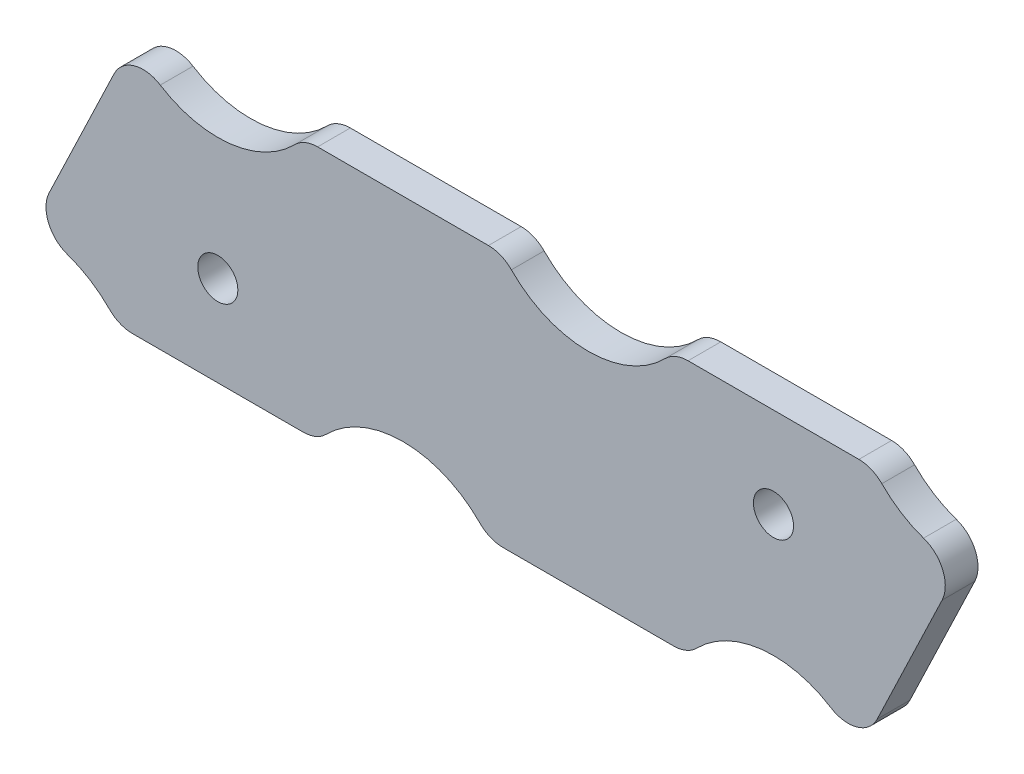
ISO-10303-21;
HEADER;
FILE_DESCRIPTION(('STEP AP214'),'2;1');
FILE_NAME('part.step','',(''),(''),'','','');
FILE_SCHEMA(('AUTOMOTIVE_DESIGN { 1 0 10303 214 1 1 1 1 }'));
ENDSEC;
DATA;
#1=APPLICATION_CONTEXT('core data for automotive mechanical design processes');
#2=APPLICATION_PROTOCOL_DEFINITION('international standard','automotive_design',2000,#1);
#3=PRODUCT_CONTEXT('',#1,'mechanical');
#4=PRODUCT('Part','Part','',(#3));
#5=PRODUCT_RELATED_PRODUCT_CATEGORY('part','',(#4));
#6=PRODUCT_DEFINITION_FORMATION('','',#4);
#7=PRODUCT_DEFINITION_CONTEXT('part definition',#1,'design');
#8=PRODUCT_DEFINITION('design','',#6,#7);
#9=PRODUCT_DEFINITION_SHAPE('','',#8);
#10=(LENGTH_UNIT() NAMED_UNIT(*) SI_UNIT(.MILLI.,.METRE.));
#11=(NAMED_UNIT(*) PLANE_ANGLE_UNIT() SI_UNIT($,.RADIAN.));
#12=(NAMED_UNIT(*) SI_UNIT($,.STERADIAN.) SOLID_ANGLE_UNIT());
#13=UNCERTAINTY_MEASURE_WITH_UNIT(LENGTH_MEASURE(1.E-05),#10,'distance_accuracy_value','');
#14=(GEOMETRIC_REPRESENTATION_CONTEXT(3) GLOBAL_UNCERTAINTY_ASSIGNED_CONTEXT((#13)) GLOBAL_UNIT_ASSIGNED_CONTEXT((#10,
#11,#12)) REPRESENTATION_CONTEXT('',''));
#15=CARTESIAN_POINT('',(0.,0.,0.));
#16=DIRECTION('',(0.,0.,1.));
#17=DIRECTION('',(1.,0.,0.));
#18=AXIS2_PLACEMENT_3D('',#15,#16,#17);
#19=CARTESIAN_POINT('',(68.275,34.775,2.032));
#20=DIRECTION('',(0.,0.,-1.));
#21=DIRECTION('',(-1.,0.,0.));
#22=AXIS2_PLACEMENT_3D('',#19,#20,#21);
#23=CYLINDRICAL_SURFACE('',#22,6.7);
#24=CARTESIAN_POINT('',(68.275,34.775,0.));
#25=DIRECTION('',(0.,0.,1.));
#26=DIRECTION('',(1.,0.,0.));
#27=AXIS2_PLACEMENT_3D('',#24,#25,#26);
#28=CIRCLE('',#27,6.7);
#29=CARTESIAN_POINT('',(63.5025512651196,30.0724758827903,0.));
#30=VERTEX_POINT('',#29);
#31=CARTESIAN_POINT('',(66.0934857954846,28.4400970192514,0.));
#32=VERTEX_POINT('',#31);
#33=EDGE_CURVE('E232',#30,#32,#28,.T.);
#34=ORIENTED_EDGE('',*,*,#33,.F.);
#35=DIRECTION('',(0.,0.,-1.));
#36=VECTOR('',#35,1.);
#37=CARTESIAN_POINT('',(63.5025512651196,30.0724758827903,2.032));
#38=LINE('',#37,#36);
#39=CARTESIAN_POINT('',(63.5025512651196,30.0724758827903,2.032));
#40=VERTEX_POINT('',#39);
#41=EDGE_CURVE('E210',#30,#40,#38,.F.);
#42=ORIENTED_EDGE('',*,*,#41,.T.);
#43=CARTESIAN_POINT('',(68.275,34.775,2.032));
#44=DIRECTION('',(0.,0.,1.));
#45=DIRECTION('',(1.,0.,0.));
#46=AXIS2_PLACEMENT_3D('',#43,#44,#45);
#47=CIRCLE('',#46,6.7);
#48=CARTESIAN_POINT('',(66.0934857954846,28.4400970192514,2.032));
#49=VERTEX_POINT('',#48);
#50=EDGE_CURVE('E265',#40,#49,#47,.T.);
#51=ORIENTED_EDGE('',*,*,#50,.T.);
#52=DIRECTION('',(0.,0.,-1.));
#53=VECTOR('',#52,1.);
#54=CARTESIAN_POINT('',(66.0934857954846,28.4400970192514,2.032));
#55=LINE('',#54,#53);
#56=EDGE_CURVE('E215',#49,#32,#55,.T.);
#57=ORIENTED_EDGE('',*,*,#56,.T.);
#58=EDGE_LOOP('',(#34,#42,#51,#57));
#59=FACE_BOUND('',#58,.T.);
#60=ADVANCED_FACE('F43',(#59),#23,.F.);
#61=CARTESIAN_POINT('',(0.,30.6687373403397,2.032));
#62=DIRECTION('',(0.,-1.,0.));
#63=DIRECTION('',(1.,0.,0.));
#64=AXIS2_PLACEMENT_3D('',#61,#62,#63);
#65=PLANE('',#64);
#66=DIRECTION('',(-1.,0.,0.));
#67=VECTOR('',#66,1.);
#68=CARTESIAN_POINT('',(0.,30.6687373403397,2.032));
#69=LINE('',#68,#67);
#70=CARTESIAN_POINT('',(62.0779397024688,30.6687373403397,2.032));
#71=VERTEX_POINT('',#70);
#72=CARTESIAN_POINT('',(51.4720602975312,30.6687373403397,2.032));
#73=VERTEX_POINT('',#72);
#74=EDGE_CURVE('E225',#71,#73,#69,.T.);
#75=ORIENTED_EDGE('',*,*,#74,.F.);
#76=DIRECTION('',(0.,0.,1.));
#77=VECTOR('',#76,1.);
#78=CARTESIAN_POINT('',(62.0779397024688,30.6687373403397,0.));
#79=LINE('',#78,#77);
#80=CARTESIAN_POINT('',(62.0779397024688,30.6687373403397,0.));
#81=VERTEX_POINT('',#80);
#82=EDGE_CURVE('E209',#71,#81,#79,.F.);
#83=ORIENTED_EDGE('',*,*,#82,.T.);
#84=DIRECTION('',(-1.,0.,0.));
#85=VECTOR('',#84,1.);
#86=CARTESIAN_POINT('',(0.,30.6687373403397,0.));
#87=LINE('',#86,#85);
#88=CARTESIAN_POINT('',(51.4720602975312,30.6687373403397,0.));
#89=VERTEX_POINT('',#88);
#90=EDGE_CURVE('E222',#81,#89,#87,.T.);
#91=ORIENTED_EDGE('',*,*,#90,.T.);
#92=DIRECTION('',(0.,0.,1.));
#93=VECTOR('',#92,1.);
#94=CARTESIAN_POINT('',(51.4720602975312,30.6687373403397,2.032));
#95=LINE('',#94,#93);
#96=EDGE_CURVE('E227',#89,#73,#95,.T.);
#97=ORIENTED_EDGE('',*,*,#96,.T.);
#98=EDGE_LOOP('',(#75,#83,#91,#97));
#99=FACE_BOUND('',#98,.T.);
#100=ADVANCED_FACE('F221',(#99),#65,.F.);
#101=CARTESIAN_POINT('',(45.275,34.775,2.032));
#102=DIRECTION('',(0.,0.,-1.));
#103=DIRECTION('',(-1.,0.,0.));
#104=AXIS2_PLACEMENT_3D('',#101,#102,#103);
#105=CYLINDRICAL_SURFACE('',#104,6.7);
#106=CARTESIAN_POINT('',(45.275,34.775,2.032));
#107=DIRECTION('',(0.,0.,1.));
#108=DIRECTION('',(1.,0.,0.));
#109=AXIS2_PLACEMENT_3D('',#106,#107,#108);
#110=CIRCLE('',#109,6.7);
#111=CARTESIAN_POINT('',(40.5025512651196,30.0724758827903,2.032));
#112=VERTEX_POINT('',#111);
#113=CARTESIAN_POINT('',(50.0474487348804,30.0724758827903,2.032));
#114=VERTEX_POINT('',#113);
#115=EDGE_CURVE('E483',#112,#114,#110,.T.);
#116=ORIENTED_EDGE('',*,*,#115,.T.);
#117=DIRECTION('',(0.,0.,-1.));
#118=VECTOR('',#117,1.);
#119=CARTESIAN_POINT('',(50.0474487348804,30.0724758827903,2.032));
#120=LINE('',#119,#118);
#121=CARTESIAN_POINT('',(50.0474487348804,30.0724758827903,0.));
#122=VERTEX_POINT('',#121);
#123=EDGE_CURVE('E316',#114,#122,#120,.T.);
#124=ORIENTED_EDGE('',*,*,#123,.T.);
#125=CARTESIAN_POINT('',(45.275,34.775,0.));
#126=DIRECTION('',(0.,0.,1.));
#127=DIRECTION('',(1.,0.,0.));
#128=AXIS2_PLACEMENT_3D('',#125,#126,#127);
#129=CIRCLE('',#128,6.7);
#130=CARTESIAN_POINT('',(40.5025512651196,30.0724758827903,0.));
#131=VERTEX_POINT('',#130);
#132=EDGE_CURVE('E231',#131,#122,#129,.T.);
#133=ORIENTED_EDGE('',*,*,#132,.F.);
#134=DIRECTION('',(0.,0.,-1.));
#135=VECTOR('',#134,1.);
#136=CARTESIAN_POINT('',(40.5025512651196,30.0724758827903,2.032));
#137=LINE('',#136,#135);
#138=EDGE_CURVE('E314',#131,#112,#137,.F.);
#139=ORIENTED_EDGE('',*,*,#138,.T.);
#140=EDGE_LOOP('',(#116,#124,#133,#139));
#141=FACE_BOUND('',#140,.T.);
#142=ADVANCED_FACE('F460',(#141),#105,.F.);
#143=CARTESIAN_POINT('',(0.,30.6687373403397,2.032));
#144=DIRECTION('',(0.,-1.,0.));
#145=DIRECTION('',(0.,0.,-1.));
#146=AXIS2_PLACEMENT_3D('',#143,#144,#145);
#147=PLANE('',#146);
#148=DIRECTION('',(-1.,0.,0.));
#149=VECTOR('',#148,1.);
#150=CARTESIAN_POINT('',(0.,30.6687373403397,2.032));
#151=LINE('',#150,#149);
#152=CARTESIAN_POINT('',(39.0779397024688,30.6687373403397,2.032));
#153=VERTEX_POINT('',#152);
#154=CARTESIAN_POINT('',(28.4720602975312,30.6687373403397,2.032));
#155=VERTEX_POINT('',#154);
#156=EDGE_CURVE('E480',#153,#155,#151,.T.);
#157=ORIENTED_EDGE('',*,*,#156,.F.);
#158=DIRECTION('',(0.,0.,1.));
#159=VECTOR('',#158,1.);
#160=CARTESIAN_POINT('',(39.0779397024688,30.6687373403397,0.));
#161=LINE('',#160,#159);
#162=CARTESIAN_POINT('',(39.0779397024688,30.6687373403397,0.));
#163=VERTEX_POINT('',#162);
#164=EDGE_CURVE('E321',#153,#163,#161,.F.);
#165=ORIENTED_EDGE('',*,*,#164,.T.);
#166=DIRECTION('',(-1.,0.,0.));
#167=VECTOR('',#166,1.);
#168=CARTESIAN_POINT('',(0.,30.6687373403397,0.));
#169=LINE('',#168,#167);
#170=CARTESIAN_POINT('',(28.4720602975312,30.6687373403397,0.));
#171=VERTEX_POINT('',#170);
#172=EDGE_CURVE('E234',#163,#171,#169,.T.);
#173=ORIENTED_EDGE('',*,*,#172,.T.);
#174=DIRECTION('',(0.,0.,1.));
#175=VECTOR('',#174,1.);
#176=CARTESIAN_POINT('',(28.4720602975312,30.6687373403397,2.032));
#177=LINE('',#176,#175);
#178=EDGE_CURVE('E319',#171,#155,#177,.T.);
#179=ORIENTED_EDGE('',*,*,#178,.T.);
#180=EDGE_LOOP('',(#157,#165,#173,#179));
#181=FACE_BOUND('',#180,.T.);
#182=ADVANCED_FACE('F485',(#181),#147,.F.);
#183=CARTESIAN_POINT('',(22.275,34.775,2.032));
#184=DIRECTION('',(0.,0.,-1.));
#185=DIRECTION('',(-1.,0.,0.));
#186=AXIS2_PLACEMENT_3D('',#183,#184,#185);
#187=CYLINDRICAL_SURFACE('',#186,6.7);
#188=CARTESIAN_POINT('',(22.275,34.775,2.032));
#189=DIRECTION('',(0.,0.,1.));
#190=DIRECTION('',(1.,0.,0.));
#191=AXIS2_PLACEMENT_3D('',#188,#189,#190);
#192=CIRCLE('',#191,6.7);
#193=CARTESIAN_POINT('',(18.7044817972191,29.1056614350869,2.032));
#194=VERTEX_POINT('',#193);
#195=CARTESIAN_POINT('',(27.0474487348804,30.0724758827903,2.032));
#196=VERTEX_POINT('',#195);
#197=EDGE_CURVE('E386',#194,#196,#192,.T.);
#198=ORIENTED_EDGE('',*,*,#197,.T.);
#199=DIRECTION('',(0.,0.,-1.));
#200=VECTOR('',#199,1.);
#201=CARTESIAN_POINT('',(27.0474487348804,30.0724758827903,2.032));
#202=LINE('',#201,#200);
#203=CARTESIAN_POINT('',(27.0474487348804,30.0724758827903,0.));
#204=VERTEX_POINT('',#203);
#205=EDGE_CURVE('E326',#196,#204,#202,.T.);
#206=ORIENTED_EDGE('',*,*,#205,.T.);
#207=CARTESIAN_POINT('',(22.275,34.775,0.));
#208=DIRECTION('',(0.,0.,1.));
#209=DIRECTION('',(1.,0.,0.));
#210=AXIS2_PLACEMENT_3D('',#207,#208,#209);
#211=CIRCLE('',#210,6.7);
#212=CARTESIAN_POINT('',(18.7044817972191,29.1056614350869,0.));
#213=VERTEX_POINT('',#212);
#214=EDGE_CURVE('E242',#213,#204,#211,.T.);
#215=ORIENTED_EDGE('',*,*,#214,.F.);
#216=DIRECTION('',(0.,0.,-1.));
#217=VECTOR('',#216,1.);
#218=CARTESIAN_POINT('',(18.7044817972191,29.1056614350869,2.032));
#219=LINE('',#218,#217);
#220=EDGE_CURVE('E324',#213,#194,#219,.F.);
#221=ORIENTED_EDGE('',*,*,#220,.T.);
#222=EDGE_LOOP('',(#198,#206,#215,#221));
#223=FACE_BOUND('',#222,.T.);
#224=ADVANCED_FACE('F544',(#223),#187,.F.);
#225=CARTESIAN_POINT('',(1.85861827457443,-0.890587923233582,2.032));
#226=DIRECTION('',(-0.901816028724632,0.432120180430553,0.));
#227=DIRECTION('',(-0.432120180430553,-0.901816028724632,0.));
#228=AXIS2_PLACEMENT_3D('',#225,#226,#227);
#229=PLANE('',#228);
#230=DIRECTION('',(0.432120180430553,0.901816028724632,0.));
#231=VECTOR('',#230,1.);
#232=CARTESIAN_POINT('',(1.85861827457443,-0.890587923233582,0.));
#233=LINE('',#232,#231);
#234=CARTESIAN_POINT('',(11.8040804170707,19.8651591567586,0.));
#235=VERTEX_POINT('',#234);
#236=CARTESIAN_POINT('',(15.8350234105815,28.2775619258248,0.));
#237=VERTEX_POINT('',#236);
#238=EDGE_CURVE('E245',#235,#237,#233,.T.);
#239=ORIENTED_EDGE('',*,*,#238,.F.);
#240=DIRECTION('',(0.,0.,-1.));
#241=VECTOR('',#240,1.);
#242=CARTESIAN_POINT('',(11.8040804170707,19.8651591567586,2.032));
#243=LINE('',#242,#241);
#244=CARTESIAN_POINT('',(11.8040804170707,19.8651591567586,2.032));
#245=VERTEX_POINT('',#244);
#246=EDGE_CURVE('E11',#235,#245,#243,.F.);
#247=ORIENTED_EDGE('',*,*,#246,.T.);
#248=DIRECTION('',(0.432120180430553,0.901816028724632,0.));
#249=VECTOR('',#248,1.);
#250=CARTESIAN_POINT('',(1.85861827457443,-0.890587923233582,2.032));
#251=LINE('',#250,#249);
#252=CARTESIAN_POINT('',(15.8350234105815,28.2775619258248,2.032));
#253=VERTEX_POINT('',#252);
#254=EDGE_CURVE('E365',#245,#253,#251,.T.);
#255=ORIENTED_EDGE('',*,*,#254,.T.);
#256=DIRECTION('',(0.,0.,-1.));
#257=VECTOR('',#256,1.);
#258=CARTESIAN_POINT('',(15.8350234105815,28.2775619258248,2.032));
#259=LINE('',#258,#257);
#260=EDGE_CURVE('E51',#253,#237,#259,.T.);
#261=ORIENTED_EDGE('',*,*,#260,.T.);
#262=EDGE_LOOP('',(#239,#247,#255,#261));
#263=FACE_BOUND('',#262,.T.);
#264=ADVANCED_FACE('F362',(#263),#229,.T.);
#265=CARTESIAN_POINT('',(10.775,10.775,2.032));
#266=DIRECTION('',(0.,0.,-1.));
#267=DIRECTION('',(-1.,0.,0.));
#268=AXIS2_PLACEMENT_3D('',#265,#266,#267);
#269=CYLINDRICAL_SURFACE('',#268,6.7);
#270=CARTESIAN_POINT('',(10.775,10.775,0.));
#271=DIRECTION('',(0.,0.,1.));
#272=DIRECTION('',(1.,0.,0.));
#273=AXIS2_PLACEMENT_3D('',#270,#271,#272);
#274=CIRCLE('',#273,6.7);
#275=CARTESIAN_POINT('',(15.5474487348804,15.4775241172097,0.));
#276=VERTEX_POINT('',#275);
#277=CARTESIAN_POINT('',(12.9565142045153,17.1099029807486,0.));
#278=VERTEX_POINT('',#277);
#279=EDGE_CURVE('E248',#276,#278,#274,.T.);
#280=ORIENTED_EDGE('',*,*,#279,.F.);
#281=DIRECTION('',(0.,0.,-1.));
#282=VECTOR('',#281,1.);
#283=CARTESIAN_POINT('',(15.5474487348804,15.4775241172097,2.032));
#284=LINE('',#283,#282);
#285=CARTESIAN_POINT('',(15.5474487348804,15.4775241172097,2.032));
#286=VERTEX_POINT('',#285);
#287=EDGE_CURVE('E337',#276,#286,#284,.F.);
#288=ORIENTED_EDGE('',*,*,#287,.T.);
#289=CARTESIAN_POINT('',(10.775,10.775,2.032));
#290=DIRECTION('',(0.,0.,1.));
#291=DIRECTION('',(1.,0.,0.));
#292=AXIS2_PLACEMENT_3D('',#289,#290,#291);
#293=CIRCLE('',#292,6.7);
#294=CARTESIAN_POINT('',(12.9565142045153,17.1099029807486,2.032));
#295=VERTEX_POINT('',#294);
#296=EDGE_CURVE('E379',#286,#295,#293,.T.);
#297=ORIENTED_EDGE('',*,*,#296,.T.);
#298=DIRECTION('',(0.,0.,-1.));
#299=VECTOR('',#298,1.);
#300=CARTESIAN_POINT('',(12.9565142045153,17.1099029807486,2.032));
#301=LINE('',#300,#299);
#302=EDGE_CURVE('E334',#295,#278,#301,.T.);
#303=ORIENTED_EDGE('',*,*,#302,.T.);
#304=EDGE_LOOP('',(#280,#288,#297,#303));
#305=FACE_BOUND('',#304,.T.);
#306=ADVANCED_FACE('F376',(#305),#269,.F.);
#307=CARTESIAN_POINT('',(0.,14.8812626596603,2.032));
#308=DIRECTION('',(0.,1.,0.));
#309=DIRECTION('',(-1.,0.,0.));
#310=AXIS2_PLACEMENT_3D('',#307,#308,#309);
#311=PLANE('',#310);
#312=DIRECTION('',(1.,0.,0.));
#313=VECTOR('',#312,1.);
#314=CARTESIAN_POINT('',(0.,14.8812626596603,2.032));
#315=LINE('',#314,#313);
#316=CARTESIAN_POINT('',(16.9720602975312,14.8812626596603,2.032));
#317=VERTEX_POINT('',#316);
#318=CARTESIAN_POINT('',(27.5779397024688,14.8812626596603,2.032));
#319=VERTEX_POINT('',#318);
#320=EDGE_CURVE('E381',#317,#319,#315,.T.);
#321=ORIENTED_EDGE('',*,*,#320,.F.);
#322=DIRECTION('',(0.,0.,1.));
#323=VECTOR('',#322,1.);
#324=CARTESIAN_POINT('',(16.9720602975312,14.8812626596603,0.));
#325=LINE('',#324,#323);
#326=CARTESIAN_POINT('',(16.9720602975312,14.8812626596603,0.));
#327=VERTEX_POINT('',#326);
#328=EDGE_CURVE('E331',#317,#327,#325,.F.);
#329=ORIENTED_EDGE('',*,*,#328,.T.);
#330=DIRECTION('',(1.,0.,0.));
#331=VECTOR('',#330,1.);
#332=CARTESIAN_POINT('',(0.,14.8812626596603,0.));
#333=LINE('',#332,#331);
#334=CARTESIAN_POINT('',(27.5779397024688,14.8812626596603,0.));
#335=VERTEX_POINT('',#334);
#336=EDGE_CURVE('E251',#327,#335,#333,.T.);
#337=ORIENTED_EDGE('',*,*,#336,.T.);
#338=DIRECTION('',(0.,0.,1.));
#339=VECTOR('',#338,1.);
#340=CARTESIAN_POINT('',(27.5779397024688,14.8812626596603,2.032));
#341=LINE('',#340,#339);
#342=EDGE_CURVE('E329',#335,#319,#341,.T.);
#343=ORIENTED_EDGE('',*,*,#342,.T.);
#344=EDGE_LOOP('',(#321,#329,#337,#343));
#345=FACE_BOUND('',#344,.T.);
#346=ADVANCED_FACE('F440',(#345),#311,.F.);
#347=CARTESIAN_POINT('',(33.775,10.775,2.032));
#348=DIRECTION('',(0.,0.,-1.));
#349=DIRECTION('',(-1.,0.,0.));
#350=AXIS2_PLACEMENT_3D('',#347,#348,#349);
#351=CYLINDRICAL_SURFACE('',#350,6.7);
#352=CARTESIAN_POINT('',(33.775,10.775,2.032));
#353=DIRECTION('',(0.,0.,1.));
#354=DIRECTION('',(1.,0.,0.));
#355=AXIS2_PLACEMENT_3D('',#352,#353,#354);
#356=CIRCLE('',#355,6.7);
#357=CARTESIAN_POINT('',(38.5474487348804,15.4775241172097,2.032));
#358=VERTEX_POINT('',#357);
#359=CARTESIAN_POINT('',(29.0025512651196,15.4775241172097,2.032));
#360=VERTEX_POINT('',#359);
#361=EDGE_CURVE('E384',#358,#360,#356,.T.);
#362=ORIENTED_EDGE('',*,*,#361,.T.);
#363=DIRECTION('',(0.,0.,-1.));
#364=VECTOR('',#363,1.);
#365=CARTESIAN_POINT('',(29.0025512651196,15.4775241172097,2.032));
#366=LINE('',#365,#364);
#367=CARTESIAN_POINT('',(29.0025512651196,15.4775241172097,0.));
#368=VERTEX_POINT('',#367);
#369=EDGE_CURVE('E341',#360,#368,#366,.T.);
#370=ORIENTED_EDGE('',*,*,#369,.T.);
#371=CARTESIAN_POINT('',(33.775,10.775,0.));
#372=DIRECTION('',(0.,0.,1.));
#373=DIRECTION('',(1.,0.,0.));
#374=AXIS2_PLACEMENT_3D('',#371,#372,#373);
#375=CIRCLE('',#374,6.7);
#376=CARTESIAN_POINT('',(38.5474487348804,15.4775241172097,0.));
#377=VERTEX_POINT('',#376);
#378=EDGE_CURVE('E254',#377,#368,#375,.T.);
#379=ORIENTED_EDGE('',*,*,#378,.F.);
#380=DIRECTION('',(0.,0.,-1.));
#381=VECTOR('',#380,1.);
#382=CARTESIAN_POINT('',(38.5474487348804,15.4775241172097,2.032));
#383=LINE('',#382,#381);
#384=EDGE_CURVE('E339',#377,#358,#383,.F.);
#385=ORIENTED_EDGE('',*,*,#384,.T.);
#386=EDGE_LOOP('',(#362,#370,#379,#385));
#387=FACE_BOUND('',#386,.T.);
#388=ADVANCED_FACE('F430',(#387),#351,.F.);
#389=CARTESIAN_POINT('',(0.,14.8812626596604,2.032));
#390=DIRECTION('',(0.,1.,0.));
#391=DIRECTION('',(0.,0.,1.));
#392=AXIS2_PLACEMENT_3D('',#389,#390,#391);
#393=PLANE('',#392);
#394=DIRECTION('',(1.,0.,0.));
#395=VECTOR('',#394,1.);
#396=CARTESIAN_POINT('',(0.,14.8812626596604,2.032));
#397=LINE('',#396,#395);
#398=CARTESIAN_POINT('',(39.9720602975312,14.8812626596604,2.032));
#399=VERTEX_POINT('',#398);
#400=CARTESIAN_POINT('',(50.5779397024688,14.8812626596604,2.032));
#401=VERTEX_POINT('',#400);
#402=EDGE_CURVE('E392',#399,#401,#397,.T.);
#403=ORIENTED_EDGE('',*,*,#402,.F.);
#404=DIRECTION('',(0.,0.,1.));
#405=VECTOR('',#404,1.);
#406=CARTESIAN_POINT('',(39.9720602975312,14.8812626596604,0.));
#407=LINE('',#406,#405);
#408=CARTESIAN_POINT('',(39.9720602975312,14.8812626596604,0.));
#409=VERTEX_POINT('',#408);
#410=EDGE_CURVE('E346',#399,#409,#407,.F.);
#411=ORIENTED_EDGE('',*,*,#410,.T.);
#412=DIRECTION('',(1.,0.,0.));
#413=VECTOR('',#412,1.);
#414=CARTESIAN_POINT('',(0.,14.8812626596604,0.));
#415=LINE('',#414,#413);
#416=CARTESIAN_POINT('',(50.5779397024688,14.8812626596604,0.));
#417=VERTEX_POINT('',#416);
#418=EDGE_CURVE('E257',#409,#417,#415,.T.);
#419=ORIENTED_EDGE('',*,*,#418,.T.);
#420=DIRECTION('',(0.,0.,1.));
#421=VECTOR('',#420,1.);
#422=CARTESIAN_POINT('',(50.5779397024688,14.8812626596604,2.032));
#423=LINE('',#422,#421);
#424=EDGE_CURVE('E344',#417,#401,#423,.T.);
#425=ORIENTED_EDGE('',*,*,#424,.T.);
#426=EDGE_LOOP('',(#403,#411,#419,#425));
#427=FACE_BOUND('',#426,.T.);
#428=ADVANCED_FACE('F422',(#427),#393,.F.);
#429=CARTESIAN_POINT('',(56.775,10.775,2.032));
#430=DIRECTION('',(0.,0.,-1.));
#431=DIRECTION('',(-1.,0.,0.));
#432=AXIS2_PLACEMENT_3D('',#429,#430,#431);
#433=CYLINDRICAL_SURFACE('',#432,6.70000000000001);
#434=CARTESIAN_POINT('',(56.775,10.775,2.032));
#435=DIRECTION('',(0.,0.,1.));
#436=DIRECTION('',(1.,0.,0.));
#437=AXIS2_PLACEMENT_3D('',#434,#435,#436);
#438=CIRCLE('',#437,6.70000000000001);
#439=CARTESIAN_POINT('',(60.3455182027809,16.4443385649131,2.032));
#440=VERTEX_POINT('',#439);
#441=CARTESIAN_POINT('',(52.0025512651196,15.4775241172097,2.032));
#442=VERTEX_POINT('',#441);
#443=EDGE_CURVE('E395',#440,#442,#438,.T.);
#444=ORIENTED_EDGE('',*,*,#443,.T.);
#445=DIRECTION('',(0.,0.,-1.));
#446=VECTOR('',#445,1.);
#447=CARTESIAN_POINT('',(52.0025512651196,15.4775241172097,2.032));
#448=LINE('',#447,#446);
#449=CARTESIAN_POINT('',(52.0025512651196,15.4775241172097,0.));
#450=VERTEX_POINT('',#449);
#451=EDGE_CURVE('E351',#442,#450,#448,.T.);
#452=ORIENTED_EDGE('',*,*,#451,.T.);
#453=CARTESIAN_POINT('',(56.775,10.775,0.));
#454=DIRECTION('',(0.,0.,1.));
#455=DIRECTION('',(1.,0.,0.));
#456=AXIS2_PLACEMENT_3D('',#453,#454,#455);
#457=CIRCLE('',#456,6.70000000000001);
#458=CARTESIAN_POINT('',(60.3455182027809,16.4443385649131,0.));
#459=VERTEX_POINT('',#458);
#460=EDGE_CURVE('E260',#459,#450,#457,.T.);
#461=ORIENTED_EDGE('',*,*,#460,.F.);
#462=DIRECTION('',(0.,0.,-1.));
#463=VECTOR('',#462,1.);
#464=CARTESIAN_POINT('',(60.3455182027809,16.4443385649131,2.032));
#465=LINE('',#464,#463);
#466=EDGE_CURVE('E349',#459,#440,#465,.F.);
#467=ORIENTED_EDGE('',*,*,#466,.T.);
#468=EDGE_LOOP('',(#444,#452,#461,#467));
#469=FACE_BOUND('',#468,.T.);
#470=ADVANCED_FACE('F413',(#469),#433,.F.);
#471=CARTESIAN_POINT('',(44.6800333314969,-21.4091826380089,2.032));
#472=DIRECTION('',(-0.901816028724632,0.432120180430553,0.));
#473=DIRECTION('',(-0.432120180430553,-0.901816028724632,0.));
#474=AXIS2_PLACEMENT_3D('',#471,#472,#473);
#475=PLANE('',#474);
#476=DIRECTION('',(0.432120180430553,0.901816028724632,0.));
#477=VECTOR('',#476,1.);
#478=CARTESIAN_POINT('',(44.6800333314969,-21.4091826380089,0.));
#479=LINE('',#478,#477);
#480=CARTESIAN_POINT('',(63.2149765894185,17.2724380741753,0.));
#481=VERTEX_POINT('',#480);
#482=CARTESIAN_POINT('',(67.2459195829293,25.6848408432414,0.));
#483=VERTEX_POINT('',#482);
#484=EDGE_CURVE('E263',#481,#483,#479,.T.);
#485=ORIENTED_EDGE('',*,*,#484,.T.);
#486=DIRECTION('',(0.,0.,1.));
#487=VECTOR('',#486,1.);
#488=CARTESIAN_POINT('',(67.2459195829293,25.6848408432414,2.032));
#489=LINE('',#488,#487);
#490=CARTESIAN_POINT('',(67.2459195829293,25.6848408432414,2.032));
#491=VERTEX_POINT('',#490);
#492=EDGE_CURVE('E58',#483,#491,#489,.T.);
#493=ORIENTED_EDGE('',*,*,#492,.T.);
#494=DIRECTION('',(0.432120180430553,0.901816028724632,0.));
#495=VECTOR('',#494,1.);
#496=CARTESIAN_POINT('',(44.6800333314969,-21.4091826380089,2.032));
#497=LINE('',#496,#495);
#498=CARTESIAN_POINT('',(63.2149765894185,17.2724380741753,2.032));
#499=VERTEX_POINT('',#498);
#500=EDGE_CURVE('E266',#499,#491,#497,.T.);
#501=ORIENTED_EDGE('',*,*,#500,.F.);
#502=DIRECTION('',(0.,0.,1.));
#503=VECTOR('',#502,1.);
#504=CARTESIAN_POINT('',(63.2149765894185,17.2724380741753,0.));
#505=LINE('',#504,#503);
#506=EDGE_CURVE('E354',#499,#481,#505,.F.);
#507=ORIENTED_EDGE('',*,*,#506,.T.);
#508=EDGE_LOOP('',(#485,#493,#501,#507));
#509=FACE_BOUND('',#508,.T.);
#510=ADVANCED_FACE('F407',(#509),#475,.F.);
#511=CARTESIAN_POINT('',(0.,0.,2.032));
#512=DIRECTION('',(0.,0.,1.));
#513=DIRECTION('',(1.,0.,0.));
#514=AXIS2_PLACEMENT_3D('',#511,#512,#513);
#515=PLANE('',#514);
#516=CARTESIAN_POINT('',(22.275,20.4920677095079,2.032));
#517=DIRECTION('',(0.,0.,1.));
#518=DIRECTION('',(1.,0.,0.));
#519=AXIS2_PLACEMENT_3D('',#516,#517,#518);
#520=CIRCLE('',#519,1.2446);
#521=CARTESIAN_POINT('',(23.5196,20.4920677095079,2.032));
#522=VERTEX_POINT('',#521);
#523=EDGE_CURVE('E500',#522,#522,#520,.T.);
#524=ORIENTED_EDGE('',*,*,#523,.F.);
#525=EDGE_LOOP('',(#524));
#526=FACE_BOUND('',#525,.T.);
#527=CARTESIAN_POINT('',(56.775,25.0579322904922,2.032));
#528=DIRECTION('',(0.,0.,1.));
#529=DIRECTION('',(1.,0.,0.));
#530=AXIS2_PLACEMENT_3D('',#527,#528,#529);
#531=CIRCLE('',#530,1.2446);
#532=CARTESIAN_POINT('',(58.0196,25.0579322904922,2.032));
#533=VERTEX_POINT('',#532);
#534=EDGE_CURVE('E497',#533,#533,#531,.T.);
#535=ORIENTED_EDGE('',*,*,#534,.F.);
#536=EDGE_LOOP('',(#535));
#537=FACE_BOUND('',#536,.T.);
#538=ORIENTED_EDGE('',*,*,#50,.F.);
#539=CARTESIAN_POINT('',(62.0779397024688,28.6687373403397,2.032));
#540=DIRECTION('',(0.,0.,1.));
#541=DIRECTION('',(1.,0.,0.));
#542=AXIS2_PLACEMENT_3D('',#539,#540,#541);
#543=CIRCLE('',#542,2.);
#544=EDGE_CURVE('E312',#40,#71,#543,.T.);
#545=ORIENTED_EDGE('',*,*,#544,.T.);
#546=ORIENTED_EDGE('',*,*,#74,.T.);
#547=CARTESIAN_POINT('',(51.4720602975312,28.6687373403397,2.032));
#548=DIRECTION('',(0.,0.,1.));
#549=DIRECTION('',(1.,0.,0.));
#550=AXIS2_PLACEMENT_3D('',#547,#548,#549);
#551=CIRCLE('',#550,2.);
#552=EDGE_CURVE('E310',#73,#114,#551,.T.);
#553=ORIENTED_EDGE('',*,*,#552,.T.);
#554=ORIENTED_EDGE('',*,*,#115,.F.);
#555=CARTESIAN_POINT('',(39.0779397024688,28.6687373403397,2.032));
#556=DIRECTION('',(0.,0.,1.));
#557=DIRECTION('',(1.,0.,0.));
#558=AXIS2_PLACEMENT_3D('',#555,#556,#557);
#559=CIRCLE('',#558,2.);
#560=EDGE_CURVE('E308',#112,#153,#559,.T.);
#561=ORIENTED_EDGE('',*,*,#560,.T.);
#562=ORIENTED_EDGE('',*,*,#156,.T.);
#563=CARTESIAN_POINT('',(28.4720602975312,28.6687373403397,2.032));
#564=DIRECTION('',(0.,0.,1.));
#565=DIRECTION('',(1.,0.,0.));
#566=AXIS2_PLACEMENT_3D('',#563,#564,#565);
#567=CIRCLE('',#566,2.);
#568=EDGE_CURVE('E306',#155,#196,#567,.T.);
#569=ORIENTED_EDGE('',*,*,#568,.T.);
#570=ORIENTED_EDGE('',*,*,#197,.F.);
#571=CARTESIAN_POINT('',(17.6386554680308,27.4133215649636,2.032));
#572=DIRECTION('',(0.,0.,1.));
#573=DIRECTION('',(1.,0.,0.));
#574=AXIS2_PLACEMENT_3D('',#571,#572,#573);
#575=CIRCLE('',#574,2.);
#576=EDGE_CURVE('E291',#194,#253,#575,.T.);
#577=ORIENTED_EDGE('',*,*,#576,.T.);
#578=ORIENTED_EDGE('',*,*,#254,.F.);
#579=CARTESIAN_POINT('',(13.6077124745199,19.0009187958975,2.032));
#580=DIRECTION('',(0.,0.,1.));
#581=DIRECTION('',(1.,0.,0.));
#582=AXIS2_PLACEMENT_3D('',#579,#580,#581);
#583=CIRCLE('',#582,2.);
#584=EDGE_CURVE('E293',#245,#295,#583,.T.);
#585=ORIENTED_EDGE('',*,*,#584,.T.);
#586=ORIENTED_EDGE('',*,*,#296,.F.);
#587=CARTESIAN_POINT('',(16.9720602975312,16.8812626596603,2.032));
#588=DIRECTION('',(0.,0.,1.));
#589=DIRECTION('',(1.,0.,0.));
#590=AXIS2_PLACEMENT_3D('',#587,#588,#589);
#591=CIRCLE('',#590,2.);
#592=EDGE_CURVE('E304',#286,#317,#591,.T.);
#593=ORIENTED_EDGE('',*,*,#592,.T.);
#594=ORIENTED_EDGE('',*,*,#320,.T.);
#595=CARTESIAN_POINT('',(27.5779397024688,16.8812626596603,2.032));
#596=DIRECTION('',(0.,0.,1.));
#597=DIRECTION('',(1.,0.,0.));
#598=AXIS2_PLACEMENT_3D('',#595,#596,#597);
#599=CIRCLE('',#598,2.);
#600=EDGE_CURVE('E302',#319,#360,#599,.T.);
#601=ORIENTED_EDGE('',*,*,#600,.T.);
#602=ORIENTED_EDGE('',*,*,#361,.F.);
#603=CARTESIAN_POINT('',(39.9720602975312,16.8812626596603,2.032));
#604=DIRECTION('',(0.,0.,1.));
#605=DIRECTION('',(1.,0.,0.));
#606=AXIS2_PLACEMENT_3D('',#603,#604,#605);
#607=CIRCLE('',#606,2.);
#608=EDGE_CURVE('E300',#358,#399,#607,.T.);
#609=ORIENTED_EDGE('',*,*,#608,.T.);
#610=ORIENTED_EDGE('',*,*,#402,.T.);
#611=CARTESIAN_POINT('',(50.5779397024688,16.8812626596603,2.032));
#612=DIRECTION('',(0.,0.,1.));
#613=DIRECTION('',(1.,0.,0.));
#614=AXIS2_PLACEMENT_3D('',#611,#612,#613);
#615=CIRCLE('',#614,2.);
#616=EDGE_CURVE('E298',#401,#442,#615,.T.);
#617=ORIENTED_EDGE('',*,*,#616,.T.);
#618=ORIENTED_EDGE('',*,*,#443,.F.);
#619=CARTESIAN_POINT('',(61.4113445319692,18.1366784350364,2.032));
#620=DIRECTION('',(0.,0.,1.));
#621=DIRECTION('',(1.,0.,0.));
#622=AXIS2_PLACEMENT_3D('',#619,#620,#621);
#623=CIRCLE('',#622,2.);
#624=EDGE_CURVE('E65',#440,#499,#623,.T.);
#625=ORIENTED_EDGE('',*,*,#624,.T.);
#626=ORIENTED_EDGE('',*,*,#500,.T.);
#627=CARTESIAN_POINT('',(65.4422875254801,26.5490812041025,2.032));
#628=DIRECTION('',(0.,0.,1.));
#629=DIRECTION('',(1.,0.,0.));
#630=AXIS2_PLACEMENT_3D('',#627,#628,#629);
#631=CIRCLE('',#630,2.);
#632=EDGE_CURVE('E296',#491,#49,#631,.T.);
#633=ORIENTED_EDGE('',*,*,#632,.T.);
#634=EDGE_LOOP('',(#538,#545,#546,#553,#554,#561,#562,#569,#570,#577,#578,#585,#586,#593,#594,
#601,#602,#609,#610,#617,#618,#625,#626,#633));
#635=FACE_BOUND('',#634,.T.);
#636=ADVANCED_FACE('F399',(#526,#537,#635),#515,.T.);
#637=CARTESIAN_POINT('',(0.,0.,0.));
#638=DIRECTION('',(0.,0.,1.));
#639=DIRECTION('',(1.,0.,0.));
#640=AXIS2_PLACEMENT_3D('',#637,#638,#639);
#641=PLANE('',#640);
#642=CARTESIAN_POINT('',(22.275,20.4920677095079,0.));
#643=DIRECTION('',(0.,0.,1.));
#644=DIRECTION('',(1.,0.,0.));
#645=AXIS2_PLACEMENT_3D('',#642,#643,#644);
#646=CIRCLE('',#645,1.2446);
#647=CARTESIAN_POINT('',(23.5196,20.4920677095079,0.));
#648=VERTEX_POINT('',#647);
#649=EDGE_CURVE('E236',#648,#648,#646,.T.);
#650=ORIENTED_EDGE('',*,*,#649,.T.);
#651=EDGE_LOOP('',(#650));
#652=FACE_BOUND('',#651,.T.);
#653=CARTESIAN_POINT('',(56.775,25.0579322904922,0.));
#654=DIRECTION('',(0.,0.,1.));
#655=DIRECTION('',(1.,0.,0.));
#656=AXIS2_PLACEMENT_3D('',#653,#654,#655);
#657=CIRCLE('',#656,1.2446);
#658=CARTESIAN_POINT('',(58.0196,25.0579322904922,0.));
#659=VERTEX_POINT('',#658);
#660=EDGE_CURVE('E494',#659,#659,#657,.T.);
#661=ORIENTED_EDGE('',*,*,#660,.T.);
#662=EDGE_LOOP('',(#661));
#663=FACE_BOUND('',#662,.T.);
#664=ORIENTED_EDGE('',*,*,#90,.F.);
#665=CARTESIAN_POINT('',(62.0779397024688,28.6687373403397,0.));
#666=DIRECTION('',(0.,0.,1.));
#667=DIRECTION('',(1.,0.,0.));
#668=AXIS2_PLACEMENT_3D('',#665,#666,#667);
#669=CIRCLE('',#668,2.);
#670=EDGE_CURVE('E205',#81,#30,#669,.F.);
#671=ORIENTED_EDGE('',*,*,#670,.T.);
#672=ORIENTED_EDGE('',*,*,#33,.T.);
#673=CARTESIAN_POINT('',(65.4422875254801,26.5490812041025,0.));
#674=DIRECTION('',(0.,0.,1.));
#675=DIRECTION('',(1.,0.,0.));
#676=AXIS2_PLACEMENT_3D('',#673,#674,#675);
#677=CIRCLE('',#676,2.);
#678=EDGE_CURVE('E273',#32,#483,#677,.F.);
#679=ORIENTED_EDGE('',*,*,#678,.T.);
#680=ORIENTED_EDGE('',*,*,#484,.F.);
#681=CARTESIAN_POINT('',(61.4113445319692,18.1366784350364,0.));
#682=DIRECTION('',(0.,0.,1.));
#683=DIRECTION('',(1.,0.,0.));
#684=AXIS2_PLACEMENT_3D('',#681,#682,#683);
#685=CIRCLE('',#684,2.);
#686=EDGE_CURVE('E271',#481,#459,#685,.F.);
#687=ORIENTED_EDGE('',*,*,#686,.T.);
#688=ORIENTED_EDGE('',*,*,#460,.T.);
#689=CARTESIAN_POINT('',(50.5779397024688,16.8812626596603,0.));
#690=DIRECTION('',(0.,0.,1.));
#691=DIRECTION('',(1.,0.,0.));
#692=AXIS2_PLACEMENT_3D('',#689,#690,#691);
#693=CIRCLE('',#692,2.);
#694=EDGE_CURVE('E275',#450,#417,#693,.F.);
#695=ORIENTED_EDGE('',*,*,#694,.T.);
#696=ORIENTED_EDGE('',*,*,#418,.F.);
#697=CARTESIAN_POINT('',(39.9720602975312,16.8812626596603,0.));
#698=DIRECTION('',(0.,0.,1.));
#699=DIRECTION('',(1.,0.,0.));
#700=AXIS2_PLACEMENT_3D('',#697,#698,#699);
#701=CIRCLE('',#700,2.);
#702=EDGE_CURVE('E277',#409,#377,#701,.F.);
#703=ORIENTED_EDGE('',*,*,#702,.T.);
#704=ORIENTED_EDGE('',*,*,#378,.T.);
#705=CARTESIAN_POINT('',(27.5779397024688,16.8812626596603,0.));
#706=DIRECTION('',(0.,0.,1.));
#707=DIRECTION('',(1.,0.,0.));
#708=AXIS2_PLACEMENT_3D('',#705,#706,#707);
#709=CIRCLE('',#708,2.);
#710=EDGE_CURVE('E279',#368,#335,#709,.F.);
#711=ORIENTED_EDGE('',*,*,#710,.T.);
#712=ORIENTED_EDGE('',*,*,#336,.F.);
#713=CARTESIAN_POINT('',(16.9720602975312,16.8812626596603,0.));
#714=DIRECTION('',(0.,0.,1.));
#715=DIRECTION('',(1.,0.,0.));
#716=AXIS2_PLACEMENT_3D('',#713,#714,#715);
#717=CIRCLE('',#716,2.);
#718=EDGE_CURVE('E281',#327,#276,#717,.F.);
#719=ORIENTED_EDGE('',*,*,#718,.T.);
#720=ORIENTED_EDGE('',*,*,#279,.T.);
#721=CARTESIAN_POINT('',(13.6077124745199,19.0009187958975,0.));
#722=DIRECTION('',(0.,0.,1.));
#723=DIRECTION('',(1.,0.,0.));
#724=AXIS2_PLACEMENT_3D('',#721,#722,#723);
#725=CIRCLE('',#724,2.);
#726=EDGE_CURVE('E269',#278,#235,#725,.F.);
#727=ORIENTED_EDGE('',*,*,#726,.T.);
#728=ORIENTED_EDGE('',*,*,#238,.T.);
#729=CARTESIAN_POINT('',(17.6386554680308,27.4133215649636,0.));
#730=DIRECTION('',(0.,0.,1.));
#731=DIRECTION('',(1.,0.,0.));
#732=AXIS2_PLACEMENT_3D('',#729,#730,#731);
#733=CIRCLE('',#732,2.);
#734=EDGE_CURVE('E226',#237,#213,#733,.F.);
#735=ORIENTED_EDGE('',*,*,#734,.T.);
#736=ORIENTED_EDGE('',*,*,#214,.T.);
#737=CARTESIAN_POINT('',(28.4720602975312,28.6687373403397,0.));
#738=DIRECTION('',(0.,0.,1.));
#739=DIRECTION('',(1.,0.,0.));
#740=AXIS2_PLACEMENT_3D('',#737,#738,#739);
#741=CIRCLE('',#740,2.);
#742=EDGE_CURVE('E283',#204,#171,#741,.F.);
#743=ORIENTED_EDGE('',*,*,#742,.T.);
#744=ORIENTED_EDGE('',*,*,#172,.F.);
#745=CARTESIAN_POINT('',(39.0779397024688,28.6687373403397,0.));
#746=DIRECTION('',(0.,0.,1.));
#747=DIRECTION('',(1.,0.,0.));
#748=AXIS2_PLACEMENT_3D('',#745,#746,#747);
#749=CIRCLE('',#748,2.);
#750=EDGE_CURVE('E285',#163,#131,#749,.F.);
#751=ORIENTED_EDGE('',*,*,#750,.T.);
#752=ORIENTED_EDGE('',*,*,#132,.T.);
#753=CARTESIAN_POINT('',(51.4720602975312,28.6687373403397,0.));
#754=DIRECTION('',(0.,0.,1.));
#755=DIRECTION('',(1.,0.,0.));
#756=AXIS2_PLACEMENT_3D('',#753,#754,#755);
#757=CIRCLE('',#756,2.);
#758=EDGE_CURVE('E216',#122,#89,#757,.F.);
#759=ORIENTED_EDGE('',*,*,#758,.T.);
#760=EDGE_LOOP('',(#664,#671,#672,#679,#680,#687,#688,#695,#696,#703,#704,#711,#712,#719,#720,
#727,#728,#735,#736,#743,#744,#751,#752,#759));
#761=FACE_BOUND('',#760,.T.);
#762=ADVANCED_FACE('F229',(#652,#663,#761),#641,.F.);
#763=CARTESIAN_POINT('',(62.0779397024688,28.6687373403397,2.032));
#764=DIRECTION('',(0.,0.,-1.));
#765=DIRECTION('',(-1.,0.,0.));
#766=AXIS2_PLACEMENT_3D('',#763,#764,#765);
#767=CYLINDRICAL_SURFACE('',#766,2.);
#768=ORIENTED_EDGE('',*,*,#544,.F.);
#769=ORIENTED_EDGE('',*,*,#41,.F.);
#770=ORIENTED_EDGE('',*,*,#670,.F.);
#771=ORIENTED_EDGE('',*,*,#82,.F.);
#772=EDGE_LOOP('',(#768,#769,#770,#771));
#773=FACE_BOUND('',#772,.T.);
#774=ADVANCED_FACE('F208',(#773),#767,.T.);
#775=CARTESIAN_POINT('',(51.4720602975312,28.6687373403397,2.032));
#776=DIRECTION('',(0.,0.,-1.));
#777=DIRECTION('',(-1.,0.,0.));
#778=AXIS2_PLACEMENT_3D('',#775,#776,#777);
#779=CYLINDRICAL_SURFACE('',#778,2.);
#780=ORIENTED_EDGE('',*,*,#552,.F.);
#781=ORIENTED_EDGE('',*,*,#96,.F.);
#782=ORIENTED_EDGE('',*,*,#758,.F.);
#783=ORIENTED_EDGE('',*,*,#123,.F.);
#784=EDGE_LOOP('',(#780,#781,#782,#783));
#785=FACE_BOUND('',#784,.T.);
#786=ADVANCED_FACE('F466',(#785),#779,.T.);
#787=CARTESIAN_POINT('',(39.0779397024688,28.6687373403397,2.032));
#788=DIRECTION('',(0.,0.,-1.));
#789=DIRECTION('',(-1.,0.,0.));
#790=AXIS2_PLACEMENT_3D('',#787,#788,#789);
#791=CYLINDRICAL_SURFACE('',#790,2.);
#792=ORIENTED_EDGE('',*,*,#560,.F.);
#793=ORIENTED_EDGE('',*,*,#138,.F.);
#794=ORIENTED_EDGE('',*,*,#750,.F.);
#795=ORIENTED_EDGE('',*,*,#164,.F.);
#796=EDGE_LOOP('',(#792,#793,#794,#795));
#797=FACE_BOUND('',#796,.T.);
#798=ADVANCED_FACE('F452',(#797),#791,.T.);
#799=CARTESIAN_POINT('',(28.4720602975312,28.6687373403397,2.032));
#800=DIRECTION('',(0.,0.,-1.));
#801=DIRECTION('',(-1.,0.,0.));
#802=AXIS2_PLACEMENT_3D('',#799,#800,#801);
#803=CYLINDRICAL_SURFACE('',#802,2.);
#804=ORIENTED_EDGE('',*,*,#568,.F.);
#805=ORIENTED_EDGE('',*,*,#178,.F.);
#806=ORIENTED_EDGE('',*,*,#742,.F.);
#807=ORIENTED_EDGE('',*,*,#205,.F.);
#808=EDGE_LOOP('',(#804,#805,#806,#807));
#809=FACE_BOUND('',#808,.T.);
#810=ADVANCED_FACE('F445',(#809),#803,.T.);
#811=CARTESIAN_POINT('',(16.9720602975312,16.8812626596603,2.032));
#812=DIRECTION('',(0.,0.,-1.));
#813=DIRECTION('',(-1.,0.,0.));
#814=AXIS2_PLACEMENT_3D('',#811,#812,#813);
#815=CYLINDRICAL_SURFACE('',#814,2.);
#816=ORIENTED_EDGE('',*,*,#592,.F.);
#817=ORIENTED_EDGE('',*,*,#287,.F.);
#818=ORIENTED_EDGE('',*,*,#718,.F.);
#819=ORIENTED_EDGE('',*,*,#328,.F.);
#820=EDGE_LOOP('',(#816,#817,#818,#819));
#821=FACE_BOUND('',#820,.T.);
#822=ADVANCED_FACE('F443',(#821),#815,.T.);
#823=CARTESIAN_POINT('',(27.5779397024688,16.8812626596603,2.032));
#824=DIRECTION('',(0.,0.,-1.));
#825=DIRECTION('',(-1.,0.,0.));
#826=AXIS2_PLACEMENT_3D('',#823,#824,#825);
#827=CYLINDRICAL_SURFACE('',#826,2.);
#828=ORIENTED_EDGE('',*,*,#600,.F.);
#829=ORIENTED_EDGE('',*,*,#342,.F.);
#830=ORIENTED_EDGE('',*,*,#710,.F.);
#831=ORIENTED_EDGE('',*,*,#369,.F.);
#832=EDGE_LOOP('',(#828,#829,#830,#831));
#833=FACE_BOUND('',#832,.T.);
#834=ADVANCED_FACE('F435',(#833),#827,.T.);
#835=CARTESIAN_POINT('',(39.9720602975312,16.8812626596603,2.032));
#836=DIRECTION('',(0.,0.,-1.));
#837=DIRECTION('',(-1.,0.,0.));
#838=AXIS2_PLACEMENT_3D('',#835,#836,#837);
#839=CYLINDRICAL_SURFACE('',#838,2.);
#840=ORIENTED_EDGE('',*,*,#608,.F.);
#841=ORIENTED_EDGE('',*,*,#384,.F.);
#842=ORIENTED_EDGE('',*,*,#702,.F.);
#843=ORIENTED_EDGE('',*,*,#410,.F.);
#844=EDGE_LOOP('',(#840,#841,#842,#843));
#845=FACE_BOUND('',#844,.T.);
#846=ADVANCED_FACE('F426',(#845),#839,.T.);
#847=CARTESIAN_POINT('',(50.5779397024688,16.8812626596603,2.032));
#848=DIRECTION('',(0.,0.,-1.));
#849=DIRECTION('',(-1.,0.,0.));
#850=AXIS2_PLACEMENT_3D('',#847,#848,#849);
#851=CYLINDRICAL_SURFACE('',#850,2.);
#852=ORIENTED_EDGE('',*,*,#616,.F.);
#853=ORIENTED_EDGE('',*,*,#424,.F.);
#854=ORIENTED_EDGE('',*,*,#694,.F.);
#855=ORIENTED_EDGE('',*,*,#451,.F.);
#856=EDGE_LOOP('',(#852,#853,#854,#855));
#857=FACE_BOUND('',#856,.T.);
#858=ADVANCED_FACE('F417',(#857),#851,.T.);
#859=CARTESIAN_POINT('',(65.4422875254801,26.5490812041025,2.032));
#860=DIRECTION('',(0.,0.,-1.));
#861=DIRECTION('',(-1.,0.,0.));
#862=AXIS2_PLACEMENT_3D('',#859,#860,#861);
#863=CYLINDRICAL_SURFACE('',#862,2.);
#864=ORIENTED_EDGE('',*,*,#632,.F.);
#865=ORIENTED_EDGE('',*,*,#492,.F.);
#866=ORIENTED_EDGE('',*,*,#678,.F.);
#867=ORIENTED_EDGE('',*,*,#56,.F.);
#868=EDGE_LOOP('',(#864,#865,#866,#867));
#869=FACE_BOUND('',#868,.T.);
#870=ADVANCED_FACE('F404',(#869),#863,.T.);
#871=CARTESIAN_POINT('',(61.4113445319692,18.1366784350364,2.032));
#872=DIRECTION('',(0.,0.,-1.));
#873=DIRECTION('',(-1.,0.,0.));
#874=AXIS2_PLACEMENT_3D('',#871,#872,#873);
#875=CYLINDRICAL_SURFACE('',#874,2.);
#876=ORIENTED_EDGE('',*,*,#624,.F.);
#877=ORIENTED_EDGE('',*,*,#466,.F.);
#878=ORIENTED_EDGE('',*,*,#686,.F.);
#879=ORIENTED_EDGE('',*,*,#506,.F.);
#880=EDGE_LOOP('',(#876,#877,#878,#879));
#881=FACE_BOUND('',#880,.T.);
#882=ADVANCED_FACE('F409',(#881),#875,.T.);
#883=CARTESIAN_POINT('',(13.6077124745199,19.0009187958975,2.032));
#884=DIRECTION('',(0.,0.,-1.));
#885=DIRECTION('',(-1.,0.,0.));
#886=AXIS2_PLACEMENT_3D('',#883,#884,#885);
#887=CYLINDRICAL_SURFACE('',#886,2.);
#888=ORIENTED_EDGE('',*,*,#584,.F.);
#889=ORIENTED_EDGE('',*,*,#246,.F.);
#890=ORIENTED_EDGE('',*,*,#726,.F.);
#891=ORIENTED_EDGE('',*,*,#302,.F.);
#892=EDGE_LOOP('',(#888,#889,#890,#891));
#893=FACE_BOUND('',#892,.T.);
#894=ADVANCED_FACE('F373',(#893),#887,.T.);
#895=CARTESIAN_POINT('',(17.6386554680308,27.4133215649636,2.032));
#896=DIRECTION('',(0.,0.,-1.));
#897=DIRECTION('',(-1.,0.,0.));
#898=AXIS2_PLACEMENT_3D('',#895,#896,#897);
#899=CYLINDRICAL_SURFACE('',#898,2.);
#900=ORIENTED_EDGE('',*,*,#576,.F.);
#901=ORIENTED_EDGE('',*,*,#220,.F.);
#902=ORIENTED_EDGE('',*,*,#734,.F.);
#903=ORIENTED_EDGE('',*,*,#260,.F.);
#904=EDGE_LOOP('',(#900,#901,#902,#903));
#905=FACE_BOUND('',#904,.T.);
#906=ADVANCED_FACE('F45',(#905),#899,.T.);
#907=CARTESIAN_POINT('',(56.775,25.0579322904922,0.));
#908=DIRECTION('',(0.,0.,1.));
#909=DIRECTION('',(1.,0.,0.));
#910=AXIS2_PLACEMENT_3D('',#907,#908,#909);
#911=CYLINDRICAL_SURFACE('',#910,1.2446);
#912=ORIENTED_EDGE('',*,*,#660,.F.);
#913=EDGE_LOOP('',(#912));
#914=FACE_BOUND('',#913,.T.);
#915=ORIENTED_EDGE('',*,*,#534,.T.);
#916=EDGE_LOOP('',(#915));
#917=FACE_BOUND('',#916,.T.);
#918=ADVANCED_FACE('F511',(#914,#917),#911,.F.);
#919=CARTESIAN_POINT('',(22.275,20.4920677095079,0.));
#920=DIRECTION('',(0.,0.,1.));
#921=DIRECTION('',(1.,0.,0.));
#922=AXIS2_PLACEMENT_3D('',#919,#920,#921);
#923=CYLINDRICAL_SURFACE('',#922,1.2446);
#924=ORIENTED_EDGE('',*,*,#649,.F.);
#925=EDGE_LOOP('',(#924));
#926=FACE_BOUND('',#925,.T.);
#927=ORIENTED_EDGE('',*,*,#523,.T.);
#928=EDGE_LOOP('',(#927));
#929=FACE_BOUND('',#928,.T.);
#930=ADVANCED_FACE('F508',(#926,#929),#923,.F.);
#931=CLOSED_SHELL('',(#60,#100,#142,#182,#224,#264,#306,#346,#388,#428,#470,#510,#636,#762,#774,
#786,#798,#810,#822,#834,#846,#858,#870,#882,#894,#906,#918,#930));
#932=MANIFOLD_SOLID_BREP('B2',#931);
#933=ADVANCED_BREP_SHAPE_REPRESENTATION('',(#18,#932),#14);
#934=SHAPE_DEFINITION_REPRESENTATION(#9,#933);
ENDSEC;
END-ISO-10303-21;
